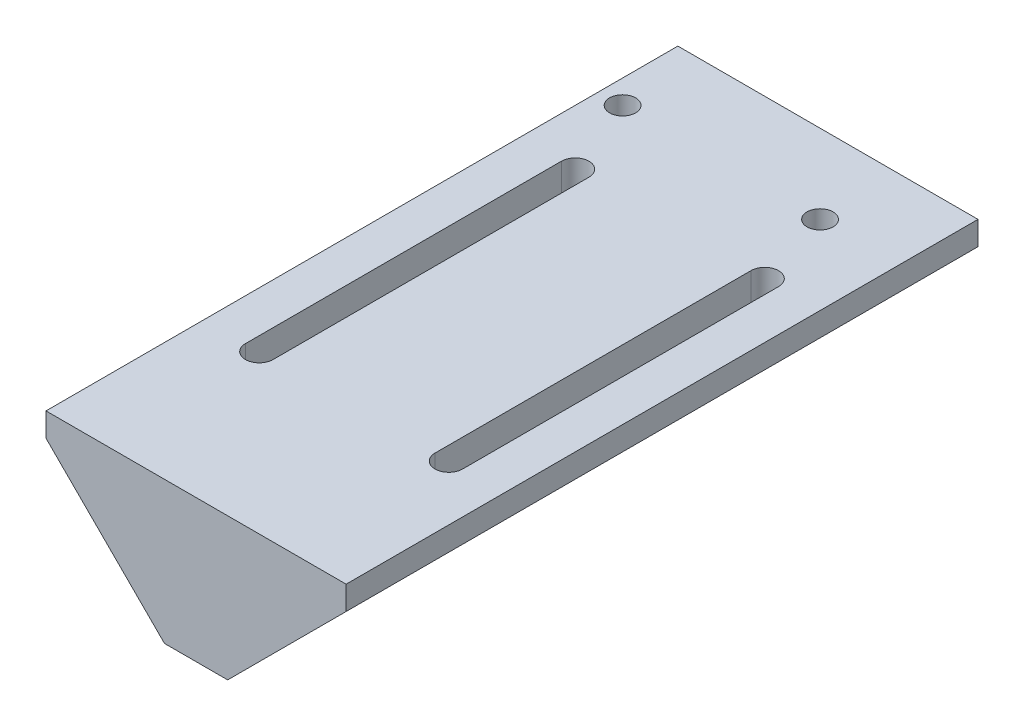
ISO-10303-21;
HEADER;
FILE_DESCRIPTION(('STEP AP214'),'2;1');
FILE_NAME('part.step','',(''),(''),'','','');
FILE_SCHEMA(('AUTOMOTIVE_DESIGN { 1 0 10303 214 1 1 1 1 }'));
ENDSEC;
DATA;
#1=APPLICATION_CONTEXT('core data for automotive mechanical design processes');
#2=APPLICATION_PROTOCOL_DEFINITION('international standard','automotive_design',2000,#1);
#3=PRODUCT_CONTEXT('',#1,'mechanical');
#4=PRODUCT('Part','Part','',(#3));
#5=PRODUCT_RELATED_PRODUCT_CATEGORY('part','',(#4));
#6=PRODUCT_DEFINITION_FORMATION('','',#4);
#7=PRODUCT_DEFINITION_CONTEXT('part definition',#1,'design');
#8=PRODUCT_DEFINITION('design','',#6,#7);
#9=PRODUCT_DEFINITION_SHAPE('','',#8);
#10=(LENGTH_UNIT() NAMED_UNIT(*) SI_UNIT(.MILLI.,.METRE.));
#11=(NAMED_UNIT(*) PLANE_ANGLE_UNIT() SI_UNIT($,.RADIAN.));
#12=(NAMED_UNIT(*) SI_UNIT($,.STERADIAN.) SOLID_ANGLE_UNIT());
#13=UNCERTAINTY_MEASURE_WITH_UNIT(LENGTH_MEASURE(1.E-05),#10,'distance_accuracy_value','');
#14=(GEOMETRIC_REPRESENTATION_CONTEXT(3) GLOBAL_UNCERTAINTY_ASSIGNED_CONTEXT((#13)) GLOBAL_UNIT_ASSIGNED_CONTEXT((#10,
#11,#12)) REPRESENTATION_CONTEXT('',''));
#15=CARTESIAN_POINT('',(0.,0.,0.));
#16=DIRECTION('',(0.,0.,1.));
#17=DIRECTION('',(1.,0.,0.));
#18=AXIS2_PLACEMENT_3D('',#15,#16,#17);
#19=CARTESIAN_POINT('',(-18.9999999999999,15.,80.));
#20=DIRECTION('',(0.707106781186549,0.707106781186546,0.));
#21=DIRECTION('',(-0.707106781186546,0.707106781186549,0.));
#22=AXIS2_PLACEMENT_3D('',#19,#20,#21);
#23=PLANE('',#22);
#24=CARTESIAN_POINT('',(-15.99753139,11.99753139,10.));
#25=DIRECTION('',(0.707106781186549,0.707106781186546,0.));
#26=DIRECTION('',(-0.707106781186546,0.707106781186549,0.));
#27=AXIS2_PLACEMENT_3D('',#24,#25,#26);
#28=ELLIPSE('',#27,2.3334523779156,1.64999999999999);
#29=CARTESIAN_POINT('',(-17.64753139,13.64753139,10.));
#30=VERTEX_POINT('',#29);
#31=EDGE_CURVE('E187',#30,#30,#28,.T.);
#32=ORIENTED_EDGE('',*,*,#31,.T.);
#33=EDGE_LOOP('',(#32));
#34=FACE_BOUND('',#33,.T.);
#35=DIRECTION('',(0.,0.,-1.));
#36=VECTOR('',#35,1.);
#37=CARTESIAN_POINT('',(-10.25,6.25000000000002,80.));
#38=LINE('',#37,#36);
#39=CARTESIAN_POINT('',(-10.25,6.25000000000002,60.));
#40=VERTEX_POINT('',#39);
#41=CARTESIAN_POINT('',(-10.25,6.25000000000003,20.));
#42=VERTEX_POINT('',#41);
#43=EDGE_CURVE('E230',#40,#42,#38,.T.);
#44=ORIENTED_EDGE('',*,*,#43,.T.);
#45=CARTESIAN_POINT('',(-12.,8.00000000000004,20.));
#46=DIRECTION('',(0.707106781186549,0.707106781186546,0.));
#47=DIRECTION('',(-0.707106781186546,0.707106781186549,0.));
#48=AXIS2_PLACEMENT_3D('',#45,#46,#47);
#49=ELLIPSE('',#48,2.47487373415292,1.75);
#50=CARTESIAN_POINT('',(-13.75,9.75000000000005,20.));
#51=VERTEX_POINT('',#50);
#52=EDGE_CURVE('E234',#42,#51,#49,.T.);
#53=ORIENTED_EDGE('',*,*,#52,.T.);
#54=DIRECTION('',(0.,0.,1.));
#55=VECTOR('',#54,1.);
#56=CARTESIAN_POINT('',(-13.75,9.75000000000003,80.));
#57=LINE('',#56,#55);
#58=CARTESIAN_POINT('',(-13.75,9.75000000000004,60.));
#59=VERTEX_POINT('',#58);
#60=EDGE_CURVE('E225',#51,#59,#57,.T.);
#61=ORIENTED_EDGE('',*,*,#60,.T.);
#62=CARTESIAN_POINT('',(-12.,8.00000000000004,60.));
#63=DIRECTION('',(0.707106781186549,0.707106781186546,0.));
#64=DIRECTION('',(-0.707106781186546,0.707106781186549,0.));
#65=AXIS2_PLACEMENT_3D('',#62,#63,#64);
#66=ELLIPSE('',#65,2.47487373415292,1.75);
#67=EDGE_CURVE('E149',#59,#40,#66,.T.);
#68=ORIENTED_EDGE('',*,*,#67,.T.);
#69=EDGE_LOOP('',(#44,#53,#61,#68));
#70=FACE_BOUND('',#69,.T.);
#71=DIRECTION('',(0.707106781186546,-0.707106781186549,0.));
#72=VECTOR('',#71,1.);
#73=CARTESIAN_POINT('',(-18.9999999999999,15.,0.));
#74=LINE('',#73,#72);
#75=CARTESIAN_POINT('',(-18.9999999999999,15.,0.));
#76=VERTEX_POINT('',#75);
#77=CARTESIAN_POINT('',(-4.,0.,0.));
#78=VERTEX_POINT('',#77);
#79=EDGE_CURVE('E238',#76,#78,#74,.T.);
#80=ORIENTED_EDGE('',*,*,#79,.T.);
#81=DIRECTION('',(0.,0.,-1.));
#82=VECTOR('',#81,1.);
#83=CARTESIAN_POINT('',(-4.,0.,80.));
#84=LINE('',#83,#82);
#85=CARTESIAN_POINT('',(-4.,0.,80.));
#86=VERTEX_POINT('',#85);
#87=EDGE_CURVE('E11',#86,#78,#84,.T.);
#88=ORIENTED_EDGE('',*,*,#87,.F.);
#89=DIRECTION('',(0.707106781186546,-0.707106781186549,0.));
#90=VECTOR('',#89,1.);
#91=CARTESIAN_POINT('',(-18.9999999999999,15.,80.));
#92=LINE('',#91,#90);
#93=CARTESIAN_POINT('',(-18.9999999999999,15.,80.));
#94=VERTEX_POINT('',#93);
#95=EDGE_CURVE('E239',#94,#86,#92,.T.);
#96=ORIENTED_EDGE('',*,*,#95,.F.);
#97=DIRECTION('',(0.,0.,-1.));
#98=VECTOR('',#97,1.);
#99=CARTESIAN_POINT('',(-18.9999999999999,15.,80.));
#100=LINE('',#99,#98);
#101=EDGE_CURVE('E259',#94,#76,#100,.T.);
#102=ORIENTED_EDGE('',*,*,#101,.T.);
#103=EDGE_LOOP('',(#80,#88,#96,#102));
#104=FACE_BOUND('',#103,.T.);
#105=ADVANCED_FACE('F43',(#34,#70,#104),#23,.F.);
#106=CARTESIAN_POINT('',(-4.,0.,80.));
#107=DIRECTION('',(0.,1.,0.));
#108=DIRECTION('',(0.,0.,1.));
#109=AXIS2_PLACEMENT_3D('',#106,#107,#108);
#110=PLANE('',#109);
#111=DIRECTION('',(1.,0.,0.));
#112=VECTOR('',#111,1.);
#113=CARTESIAN_POINT('',(-4.,0.,0.));
#114=LINE('',#113,#112);
#115=CARTESIAN_POINT('',(4.,0.,0.));
#116=VERTEX_POINT('',#115);
#117=EDGE_CURVE('E263',#78,#116,#114,.T.);
#118=ORIENTED_EDGE('',*,*,#117,.T.);
#119=DIRECTION('',(0.,0.,-1.));
#120=VECTOR('',#119,1.);
#121=CARTESIAN_POINT('',(4.,0.,80.));
#122=LINE('',#121,#120);
#123=CARTESIAN_POINT('',(4.,0.,80.));
#124=VERTEX_POINT('',#123);
#125=EDGE_CURVE('E51',#124,#116,#122,.T.);
#126=ORIENTED_EDGE('',*,*,#125,.F.);
#127=DIRECTION('',(1.,0.,0.));
#128=VECTOR('',#127,1.);
#129=CARTESIAN_POINT('',(-4.,0.,80.));
#130=LINE('',#129,#128);
#131=EDGE_CURVE('E243',#86,#124,#130,.T.);
#132=ORIENTED_EDGE('',*,*,#131,.F.);
#133=ORIENTED_EDGE('',*,*,#87,.T.);
#134=EDGE_LOOP('',(#118,#126,#132,#133));
#135=FACE_BOUND('',#134,.T.);
#136=ADVANCED_FACE('F319',(#135),#110,.F.);
#137=CARTESIAN_POINT('',(4.,0.,80.));
#138=DIRECTION('',(-0.707106781186549,0.707106781186546,0.));
#139=DIRECTION('',(-0.707106781186546,-0.707106781186549,0.));
#140=AXIS2_PLACEMENT_3D('',#137,#138,#139);
#141=PLANE('',#140);
#142=CARTESIAN_POINT('',(9.00246861,5.00246861000002,10.));
#143=DIRECTION('',(-0.707106781186549,0.707106781186546,0.));
#144=DIRECTION('',(0.707106781186546,0.707106781186549,0.));
#145=AXIS2_PLACEMENT_3D('',#142,#143,#144);
#146=ELLIPSE('',#145,2.3334523779156,1.64999999999999);
#147=CARTESIAN_POINT('',(10.65246861,6.65246861000002,10.));
#148=VERTEX_POINT('',#147);
#149=EDGE_CURVE('E354',#148,#148,#146,.T.);
#150=ORIENTED_EDGE('',*,*,#149,.T.);
#151=EDGE_LOOP('',(#150));
#152=FACE_BOUND('',#151,.T.);
#153=DIRECTION('',(0.,0.,-1.));
#154=VECTOR('',#153,1.);
#155=CARTESIAN_POINT('',(13.75,9.75000000000005,80.));
#156=LINE('',#155,#154);
#157=CARTESIAN_POINT('',(13.75,9.75000000000005,60.));
#158=VERTEX_POINT('',#157);
#159=CARTESIAN_POINT('',(13.75,9.75000000000004,20.));
#160=VERTEX_POINT('',#159);
#161=EDGE_CURVE('E217',#158,#160,#156,.T.);
#162=ORIENTED_EDGE('',*,*,#161,.T.);
#163=CARTESIAN_POINT('',(12.,8.00000000000004,20.));
#164=DIRECTION('',(-0.707106781186549,0.707106781186546,0.));
#165=DIRECTION('',(0.707106781186546,0.707106781186549,0.));
#166=AXIS2_PLACEMENT_3D('',#163,#164,#165);
#167=ELLIPSE('',#166,2.47487373415294,1.75000000000002);
#168=CARTESIAN_POINT('',(10.25,6.25,20.));
#169=VERTEX_POINT('',#168);
#170=EDGE_CURVE('E221',#160,#169,#167,.T.);
#171=ORIENTED_EDGE('',*,*,#170,.T.);
#172=DIRECTION('',(0.,0.,1.));
#173=VECTOR('',#172,1.);
#174=CARTESIAN_POINT('',(10.25,6.25000000000001,80.));
#175=LINE('',#174,#173);
#176=CARTESIAN_POINT('',(10.25,6.25,60.));
#177=VERTEX_POINT('',#176);
#178=EDGE_CURVE('E178',#169,#177,#175,.T.);
#179=ORIENTED_EDGE('',*,*,#178,.T.);
#180=CARTESIAN_POINT('',(12.,8.00000000000005,60.));
#181=DIRECTION('',(-0.707106781186549,0.707106781186546,0.));
#182=DIRECTION('',(0.707106781186546,0.707106781186549,0.));
#183=AXIS2_PLACEMENT_3D('',#180,#181,#182);
#184=ELLIPSE('',#183,2.47487373415294,1.75000000000002);
#185=EDGE_CURVE('E213',#177,#158,#184,.T.);
#186=ORIENTED_EDGE('',*,*,#185,.T.);
#187=EDGE_LOOP('',(#162,#171,#179,#186));
#188=FACE_BOUND('',#187,.T.);
#189=DIRECTION('',(0.707106781186546,0.707106781186549,0.));
#190=VECTOR('',#189,1.);
#191=CARTESIAN_POINT('',(4.,0.,0.));
#192=LINE('',#191,#190);
#193=CARTESIAN_POINT('',(18.9999999999999,15.,0.));
#194=VERTEX_POINT('',#193);
#195=EDGE_CURVE('E266',#116,#194,#192,.T.);
#196=ORIENTED_EDGE('',*,*,#195,.T.);
#197=DIRECTION('',(0.,0.,-1.));
#198=VECTOR('',#197,1.);
#199=CARTESIAN_POINT('',(18.9999999999999,15.,80.));
#200=LINE('',#199,#198);
#201=CARTESIAN_POINT('',(18.9999999999999,15.,80.));
#202=VERTEX_POINT('',#201);
#203=EDGE_CURVE('E288',#202,#194,#200,.T.);
#204=ORIENTED_EDGE('',*,*,#203,.F.);
#205=DIRECTION('',(0.707106781186546,0.707106781186549,0.));
#206=VECTOR('',#205,1.);
#207=CARTESIAN_POINT('',(4.,0.,80.));
#208=LINE('',#207,#206);
#209=EDGE_CURVE('E247',#124,#202,#208,.T.);
#210=ORIENTED_EDGE('',*,*,#209,.F.);
#211=ORIENTED_EDGE('',*,*,#125,.T.);
#212=EDGE_LOOP('',(#196,#204,#210,#211));
#213=FACE_BOUND('',#212,.T.);
#214=ADVANCED_FACE('F297',(#152,#188,#213),#141,.F.);
#215=CARTESIAN_POINT('',(18.9999999999999,15.,80.));
#216=DIRECTION('',(-1.,0.,0.));
#217=DIRECTION('',(0.,0.,1.));
#218=AXIS2_PLACEMENT_3D('',#215,#216,#217);
#219=PLANE('',#218);
#220=DIRECTION('',(0.,1.,0.));
#221=VECTOR('',#220,1.);
#222=CARTESIAN_POINT('',(18.9999999999999,15.,0.));
#223=LINE('',#222,#221);
#224=CARTESIAN_POINT('',(18.9999999999999,18.,0.));
#225=VERTEX_POINT('',#224);
#226=EDGE_CURVE('E269',#194,#225,#223,.T.);
#227=ORIENTED_EDGE('',*,*,#226,.T.);
#228=DIRECTION('',(0.,0.,-1.));
#229=VECTOR('',#228,1.);
#230=CARTESIAN_POINT('',(18.9999999999999,18.,80.));
#231=LINE('',#230,#229);
#232=CARTESIAN_POINT('',(18.9999999999999,18.,80.));
#233=VERTEX_POINT('',#232);
#234=EDGE_CURVE('E284',#233,#225,#231,.T.);
#235=ORIENTED_EDGE('',*,*,#234,.F.);
#236=DIRECTION('',(0.,1.,0.));
#237=VECTOR('',#236,1.);
#238=CARTESIAN_POINT('',(18.9999999999999,15.,80.));
#239=LINE('',#238,#237);
#240=EDGE_CURVE('E250',#202,#233,#239,.T.);
#241=ORIENTED_EDGE('',*,*,#240,.F.);
#242=ORIENTED_EDGE('',*,*,#203,.T.);
#243=EDGE_LOOP('',(#227,#235,#241,#242));
#244=FACE_BOUND('',#243,.T.);
#245=ADVANCED_FACE('F308',(#244),#219,.F.);
#246=CARTESIAN_POINT('',(18.9999999999999,18.,80.));
#247=DIRECTION('',(0.,-1.,0.));
#248=DIRECTION('',(0.,0.,-1.));
#249=AXIS2_PLACEMENT_3D('',#246,#247,#248);
#250=PLANE('',#249);
#251=CARTESIAN_POINT('',(9.00246861,18.,10.));
#252=DIRECTION('',(0.,1.,0.));
#253=DIRECTION('',(0.,0.,1.));
#254=AXIS2_PLACEMENT_3D('',#251,#252,#253);
#255=CIRCLE('',#254,1.64999999999999);
#256=CARTESIAN_POINT('',(9.00246861,18.,11.65));
#257=VERTEX_POINT('',#256);
#258=EDGE_CURVE('E358',#257,#257,#255,.T.);
#259=ORIENTED_EDGE('',*,*,#258,.F.);
#260=EDGE_LOOP('',(#259));
#261=FACE_BOUND('',#260,.T.);
#262=CARTESIAN_POINT('',(-15.99753139,18.,10.));
#263=DIRECTION('',(0.,1.,0.));
#264=DIRECTION('',(0.,0.,1.));
#265=AXIS2_PLACEMENT_3D('',#262,#263,#264);
#266=CIRCLE('',#265,1.64999999999999);
#267=CARTESIAN_POINT('',(-15.99753139,18.,11.65));
#268=VERTEX_POINT('',#267);
#269=EDGE_CURVE('E350',#268,#268,#266,.T.);
#270=ORIENTED_EDGE('',*,*,#269,.F.);
#271=EDGE_LOOP('',(#270));
#272=FACE_BOUND('',#271,.T.);
#273=DIRECTION('',(0.,0.,1.));
#274=VECTOR('',#273,1.);
#275=CARTESIAN_POINT('',(-13.75,18.,20.));
#276=LINE('',#275,#274);
#277=CARTESIAN_POINT('',(-13.75,18.,20.));
#278=VERTEX_POINT('',#277);
#279=CARTESIAN_POINT('',(-13.75,18.,60.));
#280=VERTEX_POINT('',#279);
#281=EDGE_CURVE('E157',#278,#280,#276,.T.);
#282=ORIENTED_EDGE('',*,*,#281,.F.);
#283=CARTESIAN_POINT('',(-12.,18.,20.));
#284=DIRECTION('',(0.,1.,0.));
#285=DIRECTION('',(0.,0.,1.));
#286=AXIS2_PLACEMENT_3D('',#283,#284,#285);
#287=CIRCLE('',#286,1.75);
#288=CARTESIAN_POINT('',(-10.25,18.,20.));
#289=VERTEX_POINT('',#288);
#290=EDGE_CURVE('E163',#289,#278,#287,.T.);
#291=ORIENTED_EDGE('',*,*,#290,.F.);
#292=DIRECTION('',(0.,0.,-1.));
#293=VECTOR('',#292,1.);
#294=CARTESIAN_POINT('',(-10.25,18.,20.));
#295=LINE('',#294,#293);
#296=CARTESIAN_POINT('',(-10.25,18.,60.));
#297=VERTEX_POINT('',#296);
#298=EDGE_CURVE('E168',#297,#289,#295,.T.);
#299=ORIENTED_EDGE('',*,*,#298,.F.);
#300=CARTESIAN_POINT('',(-12.,18.,60.));
#301=DIRECTION('',(0.,1.,0.));
#302=DIRECTION('',(0.,0.,1.));
#303=AXIS2_PLACEMENT_3D('',#300,#301,#302);
#304=CIRCLE('',#303,1.75);
#305=EDGE_CURVE('E146',#280,#297,#304,.T.);
#306=ORIENTED_EDGE('',*,*,#305,.F.);
#307=EDGE_LOOP('',(#282,#291,#299,#306));
#308=FACE_BOUND('',#307,.T.);
#309=DIRECTION('',(0.,0.,1.));
#310=VECTOR('',#309,1.);
#311=CARTESIAN_POINT('',(10.25,18.,20.));
#312=LINE('',#311,#310);
#313=CARTESIAN_POINT('',(10.25,18.,20.));
#314=VERTEX_POINT('',#313);
#315=CARTESIAN_POINT('',(10.25,18.,60.));
#316=VERTEX_POINT('',#315);
#317=EDGE_CURVE('E186',#314,#316,#312,.T.);
#318=ORIENTED_EDGE('',*,*,#317,.F.);
#319=CARTESIAN_POINT('',(12.,18.,20.));
#320=DIRECTION('',(0.,1.,0.));
#321=DIRECTION('',(0.,0.,1.));
#322=AXIS2_PLACEMENT_3D('',#319,#320,#321);
#323=CIRCLE('',#322,1.75000000000002);
#324=CARTESIAN_POINT('',(13.75,18.,20.));
#325=VERTEX_POINT('',#324);
#326=EDGE_CURVE('E183',#325,#314,#323,.T.);
#327=ORIENTED_EDGE('',*,*,#326,.F.);
#328=DIRECTION('',(0.,0.,-1.));
#329=VECTOR('',#328,1.);
#330=CARTESIAN_POINT('',(13.75,18.,20.));
#331=LINE('',#330,#329);
#332=CARTESIAN_POINT('',(13.75,18.,60.));
#333=VERTEX_POINT('',#332);
#334=EDGE_CURVE('E194',#333,#325,#331,.T.);
#335=ORIENTED_EDGE('',*,*,#334,.F.);
#336=CARTESIAN_POINT('',(12.,18.,60.));
#337=DIRECTION('',(0.,1.,0.));
#338=DIRECTION('',(0.,0.,1.));
#339=AXIS2_PLACEMENT_3D('',#336,#337,#338);
#340=CIRCLE('',#339,1.75000000000002);
#341=EDGE_CURVE('E190',#316,#333,#340,.T.);
#342=ORIENTED_EDGE('',*,*,#341,.F.);
#343=EDGE_LOOP('',(#318,#327,#335,#342));
#344=FACE_BOUND('',#343,.T.);
#345=DIRECTION('',(-1.,0.,0.));
#346=VECTOR('',#345,1.);
#347=CARTESIAN_POINT('',(18.9999999999999,18.,0.));
#348=LINE('',#347,#346);
#349=CARTESIAN_POINT('',(-19.,18.,0.));
#350=VERTEX_POINT('',#349);
#351=EDGE_CURVE('E272',#225,#350,#348,.T.);
#352=ORIENTED_EDGE('',*,*,#351,.T.);
#353=DIRECTION('',(0.,0.,-1.));
#354=VECTOR('',#353,1.);
#355=CARTESIAN_POINT('',(-19.,18.,80.));
#356=LINE('',#355,#354);
#357=CARTESIAN_POINT('',(-19.,18.,80.));
#358=VERTEX_POINT('',#357);
#359=EDGE_CURVE('E280',#358,#350,#356,.T.);
#360=ORIENTED_EDGE('',*,*,#359,.F.);
#361=DIRECTION('',(-1.,0.,0.));
#362=VECTOR('',#361,1.);
#363=CARTESIAN_POINT('',(18.9999999999999,18.,80.));
#364=LINE('',#363,#362);
#365=EDGE_CURVE('E253',#233,#358,#364,.T.);
#366=ORIENTED_EDGE('',*,*,#365,.F.);
#367=ORIENTED_EDGE('',*,*,#234,.T.);
#368=EDGE_LOOP('',(#352,#360,#366,#367));
#369=FACE_BOUND('',#368,.T.);
#370=ADVANCED_FACE('F165',(#261,#272,#308,#344,#369),#250,.F.);
#371=CARTESIAN_POINT('',(-19.,18.,80.));
#372=DIRECTION('',(1.,0.,0.));
#373=DIRECTION('',(0.,1.,0.));
#374=AXIS2_PLACEMENT_3D('',#371,#372,#373);
#375=PLANE('',#374);
#376=DIRECTION('',(0.,-1.,0.));
#377=VECTOR('',#376,1.);
#378=CARTESIAN_POINT('',(-19.,18.,0.));
#379=LINE('',#378,#377);
#380=EDGE_CURVE('E244',#350,#76,#379,.T.);
#381=ORIENTED_EDGE('',*,*,#380,.T.);
#382=ORIENTED_EDGE('',*,*,#101,.F.);
#383=DIRECTION('',(0.,-1.,0.));
#384=VECTOR('',#383,1.);
#385=CARTESIAN_POINT('',(-19.,18.,80.));
#386=LINE('',#385,#384);
#387=EDGE_CURVE('E256',#358,#94,#386,.T.);
#388=ORIENTED_EDGE('',*,*,#387,.F.);
#389=ORIENTED_EDGE('',*,*,#359,.T.);
#390=EDGE_LOOP('',(#381,#382,#388,#389));
#391=FACE_BOUND('',#390,.T.);
#392=ADVANCED_FACE('F322',(#391),#375,.F.);
#393=CARTESIAN_POINT('',(0.,0.,80.));
#394=DIRECTION('',(0.,0.,1.));
#395=DIRECTION('',(1.,0.,0.));
#396=AXIS2_PLACEMENT_3D('',#393,#394,#395);
#397=PLANE('',#396);
#398=ORIENTED_EDGE('',*,*,#95,.T.);
#399=ORIENTED_EDGE('',*,*,#131,.T.);
#400=ORIENTED_EDGE('',*,*,#209,.T.);
#401=ORIENTED_EDGE('',*,*,#240,.T.);
#402=ORIENTED_EDGE('',*,*,#365,.T.);
#403=ORIENTED_EDGE('',*,*,#387,.T.);
#404=EDGE_LOOP('',(#398,#399,#400,#401,#402,#403));
#405=FACE_BOUND('',#404,.T.);
#406=ADVANCED_FACE('F315',(#405),#397,.T.);
#407=CARTESIAN_POINT('',(0.,0.,0.));
#408=DIRECTION('',(0.,0.,1.));
#409=DIRECTION('',(1.,0.,0.));
#410=AXIS2_PLACEMENT_3D('',#407,#408,#409);
#411=PLANE('',#410);
#412=ORIENTED_EDGE('',*,*,#79,.F.);
#413=ORIENTED_EDGE('',*,*,#380,.F.);
#414=ORIENTED_EDGE('',*,*,#351,.F.);
#415=ORIENTED_EDGE('',*,*,#226,.F.);
#416=ORIENTED_EDGE('',*,*,#195,.F.);
#417=ORIENTED_EDGE('',*,*,#117,.F.);
#418=EDGE_LOOP('',(#412,#413,#414,#415,#416,#417));
#419=FACE_BOUND('',#418,.T.);
#420=ADVANCED_FACE('F303',(#419),#411,.F.);
#421=CARTESIAN_POINT('',(12.,-22.,20.));
#422=DIRECTION('',(0.,1.,0.));
#423=DIRECTION('',(0.,0.,1.));
#424=AXIS2_PLACEMENT_3D('',#421,#422,#423);
#425=CYLINDRICAL_SURFACE('',#424,1.75000000000002);
#426=DIRECTION('',(0.,1.,0.));
#427=VECTOR('',#426,1.);
#428=CARTESIAN_POINT('',(13.75,-22.,20.));
#429=LINE('',#428,#427);
#430=EDGE_CURVE('E199',#160,#325,#429,.T.);
#431=ORIENTED_EDGE('',*,*,#430,.T.);
#432=ORIENTED_EDGE('',*,*,#326,.T.);
#433=DIRECTION('',(0.,1.,0.));
#434=VECTOR('',#433,1.);
#435=CARTESIAN_POINT('',(10.25,-22.,20.));
#436=LINE('',#435,#434);
#437=EDGE_CURVE('E198',#169,#314,#436,.T.);
#438=ORIENTED_EDGE('',*,*,#437,.F.);
#439=ORIENTED_EDGE('',*,*,#170,.F.);
#440=EDGE_LOOP('',(#431,#432,#438,#439));
#441=FACE_BOUND('',#440,.T.);
#442=ADVANCED_FACE('F390',(#441),#425,.F.);
#443=CARTESIAN_POINT('',(13.75,-22.,20.));
#444=DIRECTION('',(1.,0.,0.));
#445=DIRECTION('',(0.,0.,-1.));
#446=AXIS2_PLACEMENT_3D('',#443,#444,#445);
#447=PLANE('',#446);
#448=DIRECTION('',(0.,1.,0.));
#449=VECTOR('',#448,1.);
#450=CARTESIAN_POINT('',(13.75,-22.,60.));
#451=LINE('',#450,#449);
#452=EDGE_CURVE('E202',#158,#333,#451,.T.);
#453=ORIENTED_EDGE('',*,*,#452,.T.);
#454=ORIENTED_EDGE('',*,*,#334,.T.);
#455=ORIENTED_EDGE('',*,*,#430,.F.);
#456=ORIENTED_EDGE('',*,*,#161,.F.);
#457=EDGE_LOOP('',(#453,#454,#455,#456));
#458=FACE_BOUND('',#457,.T.);
#459=ADVANCED_FACE('F386',(#458),#447,.F.);
#460=CARTESIAN_POINT('',(12.,-22.,60.));
#461=DIRECTION('',(0.,1.,0.));
#462=DIRECTION('',(0.,0.,1.));
#463=AXIS2_PLACEMENT_3D('',#460,#461,#462);
#464=CYLINDRICAL_SURFACE('',#463,1.75000000000002);
#465=DIRECTION('',(0.,1.,0.));
#466=VECTOR('',#465,1.);
#467=CARTESIAN_POINT('',(10.25,-22.,60.));
#468=LINE('',#467,#466);
#469=EDGE_CURVE('E66',#177,#316,#468,.T.);
#470=ORIENTED_EDGE('',*,*,#469,.T.);
#471=ORIENTED_EDGE('',*,*,#341,.T.);
#472=ORIENTED_EDGE('',*,*,#452,.F.);
#473=ORIENTED_EDGE('',*,*,#185,.F.);
#474=EDGE_LOOP('',(#470,#471,#472,#473));
#475=FACE_BOUND('',#474,.T.);
#476=ADVANCED_FACE('F389',(#475),#464,.F.);
#477=CARTESIAN_POINT('',(10.25,-22.,20.));
#478=DIRECTION('',(-1.,0.,0.));
#479=DIRECTION('',(0.,0.,1.));
#480=AXIS2_PLACEMENT_3D('',#477,#478,#479);
#481=PLANE('',#480);
#482=ORIENTED_EDGE('',*,*,#437,.T.);
#483=ORIENTED_EDGE('',*,*,#317,.T.);
#484=ORIENTED_EDGE('',*,*,#469,.F.);
#485=ORIENTED_EDGE('',*,*,#178,.F.);
#486=EDGE_LOOP('',(#482,#483,#484,#485));
#487=FACE_BOUND('',#486,.T.);
#488=ADVANCED_FACE('F385',(#487),#481,.F.);
#489=CARTESIAN_POINT('',(-12.,-22.,20.));
#490=DIRECTION('',(0.,1.,0.));
#491=DIRECTION('',(0.,0.,1.));
#492=AXIS2_PLACEMENT_3D('',#489,#490,#491);
#493=CYLINDRICAL_SURFACE('',#492,1.75);
#494=DIRECTION('',(0.,1.,0.));
#495=VECTOR('',#494,1.);
#496=CARTESIAN_POINT('',(-10.25,-22.,20.));
#497=LINE('',#496,#495);
#498=EDGE_CURVE('E175',#42,#289,#497,.T.);
#499=ORIENTED_EDGE('',*,*,#498,.T.);
#500=ORIENTED_EDGE('',*,*,#290,.T.);
#501=DIRECTION('',(0.,1.,0.));
#502=VECTOR('',#501,1.);
#503=CARTESIAN_POINT('',(-13.75,-22.,20.));
#504=LINE('',#503,#502);
#505=EDGE_CURVE('E153',#51,#278,#504,.T.);
#506=ORIENTED_EDGE('',*,*,#505,.F.);
#507=ORIENTED_EDGE('',*,*,#52,.F.);
#508=EDGE_LOOP('',(#499,#500,#506,#507));
#509=FACE_BOUND('',#508,.T.);
#510=ADVANCED_FACE('F345',(#509),#493,.F.);
#511=CARTESIAN_POINT('',(-10.25,-22.,20.));
#512=DIRECTION('',(1.,0.,0.));
#513=DIRECTION('',(0.,0.,-1.));
#514=AXIS2_PLACEMENT_3D('',#511,#512,#513);
#515=PLANE('',#514);
#516=DIRECTION('',(0.,1.,0.));
#517=VECTOR('',#516,1.);
#518=CARTESIAN_POINT('',(-10.25,-22.,60.));
#519=LINE('',#518,#517);
#520=EDGE_CURVE('E152',#40,#297,#519,.T.);
#521=ORIENTED_EDGE('',*,*,#520,.T.);
#522=ORIENTED_EDGE('',*,*,#298,.T.);
#523=ORIENTED_EDGE('',*,*,#498,.F.);
#524=ORIENTED_EDGE('',*,*,#43,.F.);
#525=EDGE_LOOP('',(#521,#522,#523,#524));
#526=FACE_BOUND('',#525,.T.);
#527=ADVANCED_FACE('F343',(#526),#515,.F.);
#528=CARTESIAN_POINT('',(-12.,-22.,60.));
#529=DIRECTION('',(0.,1.,0.));
#530=DIRECTION('',(0.,0.,1.));
#531=AXIS2_PLACEMENT_3D('',#528,#529,#530);
#532=CYLINDRICAL_SURFACE('',#531,1.75);
#533=DIRECTION('',(0.,1.,0.));
#534=VECTOR('',#533,1.);
#535=CARTESIAN_POINT('',(-13.75,-22.,60.));
#536=LINE('',#535,#534);
#537=EDGE_CURVE('E58',#59,#280,#536,.T.);
#538=ORIENTED_EDGE('',*,*,#537,.T.);
#539=ORIENTED_EDGE('',*,*,#305,.T.);
#540=ORIENTED_EDGE('',*,*,#520,.F.);
#541=ORIENTED_EDGE('',*,*,#67,.F.);
#542=EDGE_LOOP('',(#538,#539,#540,#541));
#543=FACE_BOUND('',#542,.T.);
#544=ADVANCED_FACE('F143',(#543),#532,.F.);
#545=CARTESIAN_POINT('',(-13.75,-22.,20.));
#546=DIRECTION('',(-1.,0.,0.));
#547=DIRECTION('',(0.,0.,1.));
#548=AXIS2_PLACEMENT_3D('',#545,#546,#547);
#549=PLANE('',#548);
#550=ORIENTED_EDGE('',*,*,#505,.T.);
#551=ORIENTED_EDGE('',*,*,#281,.T.);
#552=ORIENTED_EDGE('',*,*,#537,.F.);
#553=ORIENTED_EDGE('',*,*,#60,.F.);
#554=EDGE_LOOP('',(#550,#551,#552,#553));
#555=FACE_BOUND('',#554,.T.);
#556=ADVANCED_FACE('F158',(#555),#549,.F.);
#557=CARTESIAN_POINT('',(-15.99753139,18.,10.));
#558=DIRECTION('',(0.,1.,0.));
#559=DIRECTION('',(0.,0.,1.));
#560=AXIS2_PLACEMENT_3D('',#557,#558,#559);
#561=CYLINDRICAL_SURFACE('',#560,1.64999999999999);
#562=ORIENTED_EDGE('',*,*,#269,.T.);
#563=EDGE_LOOP('',(#562));
#564=FACE_BOUND('',#563,.T.);
#565=ORIENTED_EDGE('',*,*,#31,.F.);
#566=EDGE_LOOP('',(#565));
#567=FACE_BOUND('',#566,.T.);
#568=ADVANCED_FACE('F368',(#564,#567),#561,.F.);
#569=CARTESIAN_POINT('',(9.00246861,18.,10.));
#570=DIRECTION('',(0.,1.,0.));
#571=DIRECTION('',(0.,0.,1.));
#572=AXIS2_PLACEMENT_3D('',#569,#570,#571);
#573=CYLINDRICAL_SURFACE('',#572,1.64999999999999);
#574=ORIENTED_EDGE('',*,*,#258,.T.);
#575=EDGE_LOOP('',(#574));
#576=FACE_BOUND('',#575,.T.);
#577=ORIENTED_EDGE('',*,*,#149,.F.);
#578=EDGE_LOOP('',(#577));
#579=FACE_BOUND('',#578,.T.);
#580=ADVANCED_FACE('F363',(#576,#579),#573,.F.);
#581=CLOSED_SHELL('',(#105,#136,#214,#245,#370,#392,#406,#420,#442,#459,#476,#488,#510,#527,
#544,#556,#568,#580));
#582=MANIFOLD_SOLID_BREP('B2',#581);
#583=ADVANCED_BREP_SHAPE_REPRESENTATION('',(#18,#582),#14);
#584=SHAPE_DEFINITION_REPRESENTATION(#9,#583);
ENDSEC;
END-ISO-10303-21;
